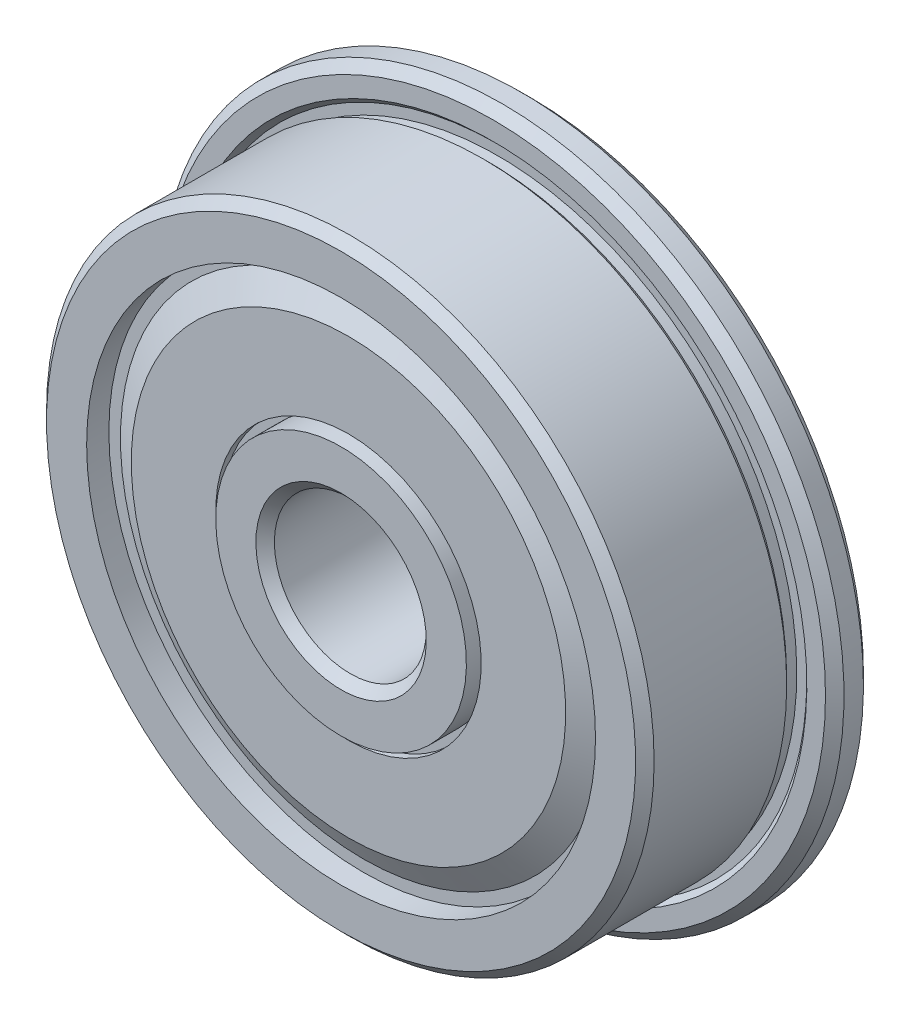
ISO-10303-21;
HEADER;
FILE_DESCRIPTION(('STEP AP214'),'2;1');
FILE_NAME('part.step','',(''),(''),'','','');
FILE_SCHEMA(('AUTOMOTIVE_DESIGN { 1 0 10303 214 1 1 1 1 }'));
ENDSEC;
DATA;
#1=APPLICATION_CONTEXT('core data for automotive mechanical design processes');
#2=APPLICATION_PROTOCOL_DEFINITION('international standard','automotive_design',2000,#1);
#3=PRODUCT_CONTEXT('',#1,'mechanical');
#4=PRODUCT('Part','Part','',(#3));
#5=PRODUCT_RELATED_PRODUCT_CATEGORY('part','',(#4));
#6=PRODUCT_DEFINITION_FORMATION('','',#4);
#7=PRODUCT_DEFINITION_CONTEXT('part definition',#1,'design');
#8=PRODUCT_DEFINITION('design','',#6,#7);
#9=PRODUCT_DEFINITION_SHAPE('','',#8);
#10=(LENGTH_UNIT() NAMED_UNIT(*) SI_UNIT(.MILLI.,.METRE.));
#11=(NAMED_UNIT(*) PLANE_ANGLE_UNIT() SI_UNIT($,.RADIAN.));
#12=(NAMED_UNIT(*) SI_UNIT($,.STERADIAN.) SOLID_ANGLE_UNIT());
#13=UNCERTAINTY_MEASURE_WITH_UNIT(LENGTH_MEASURE(1.E-05),#10,'distance_accuracy_value','');
#14=(GEOMETRIC_REPRESENTATION_CONTEXT(3) GLOBAL_UNCERTAINTY_ASSIGNED_CONTEXT((#13)) GLOBAL_UNIT_ASSIGNED_CONTEXT((#10,
#11,#12)) REPRESENTATION_CONTEXT('',''));
#15=CARTESIAN_POINT('',(0.,0.,0.));
#16=DIRECTION('',(0.,0.,1.));
#17=DIRECTION('',(1.,0.,0.));
#18=AXIS2_PLACEMENT_3D('',#15,#16,#17);
#19=CARTESIAN_POINT('',(0.,0.,0.));
#20=DIRECTION('',(0.,0.,1.));
#21=DIRECTION('',(0.,-1.,0.));
#22=AXIS2_PLACEMENT_3D('',#19,#20,#21);
#23=CYLINDRICAL_SURFACE('',#22,6.7);
#24=CARTESIAN_POINT('',(0.,0.,-1.72));
#25=DIRECTION('',(0.,0.,1.));
#26=DIRECTION('',(0.,-1.,0.));
#27=AXIS2_PLACEMENT_3D('',#24,#25,#26);
#28=CIRCLE('',#27,6.7);
#29=CARTESIAN_POINT('',(0.,-6.7,-1.72));
#30=VERTEX_POINT('',#29);
#31=EDGE_CURVE('E78',#30,#30,#28,.T.);
#32=ORIENTED_EDGE('',*,*,#31,.F.);
#33=EDGE_LOOP('',(#32));
#34=FACE_BOUND('',#33,.T.);
#35=CARTESIAN_POINT('',(0.,0.,-1.915));
#36=DIRECTION('',(0.,0.,1.));
#37=DIRECTION('',(0.,-1.,0.));
#38=AXIS2_PLACEMENT_3D('',#35,#36,#37);
#39=CIRCLE('',#38,6.7);
#40=CARTESIAN_POINT('',(0.,-6.7,-1.915));
#41=VERTEX_POINT('',#40);
#42=EDGE_CURVE('E12',#41,#41,#39,.T.);
#43=ORIENTED_EDGE('',*,*,#42,.T.);
#44=EDGE_LOOP('',(#43));
#45=FACE_BOUND('',#44,.T.);
#46=ADVANCED_FACE('F50',(#34,#45),#23,.T.);
#47=CARTESIAN_POINT('',(0.,6.7,-1.915));
#48=DIRECTION('',(0.,0.,1.));
#49=DIRECTION('',(0.,-1.,0.));
#50=AXIS2_PLACEMENT_3D('',#47,#48,#49);
#51=PLANE('',#50);
#52=ORIENTED_EDGE('',*,*,#42,.F.);
#53=EDGE_LOOP('',(#52));
#54=FACE_BOUND('',#53,.T.);
#55=CARTESIAN_POINT('',(0.,0.,-1.915));
#56=DIRECTION('',(0.,0.,1.));
#57=DIRECTION('',(0.,-1.,0.));
#58=AXIS2_PLACEMENT_3D('',#55,#56,#57);
#59=CIRCLE('',#58,6.39510723538121);
#60=CARTESIAN_POINT('',(0.,-6.39510723538121,-1.915));
#61=VERTEX_POINT('',#60);
#62=EDGE_CURVE('E56',#61,#61,#59,.T.);
#63=ORIENTED_EDGE('',*,*,#62,.T.);
#64=EDGE_LOOP('',(#63));
#65=FACE_BOUND('',#64,.T.);
#66=ADVANCED_FACE('F85',(#54,#65),#51,.F.);
#67=CARTESIAN_POINT('',(0.,0.,-2.305));
#68=DIRECTION('',(0.,0.,1.));
#69=DIRECTION('',(0.,-1.,0.));
#70=AXIS2_PLACEMENT_3D('',#67,#68,#69);
#71=CONICAL_SURFACE('',#70,5.71960742042935,1.0471975511966);
#72=ORIENTED_EDGE('',*,*,#62,.F.);
#73=EDGE_LOOP('',(#72));
#74=FACE_BOUND('',#73,.T.);
#75=CARTESIAN_POINT('',(0.,0.,-2.305));
#76=DIRECTION('',(0.,0.,1.));
#77=DIRECTION('',(0.,-1.,0.));
#78=AXIS2_PLACEMENT_3D('',#75,#76,#77);
#79=CIRCLE('',#78,5.71960742042935);
#80=CARTESIAN_POINT('',(0.,-5.71960742042935,-2.305));
#81=VERTEX_POINT('',#80);
#82=EDGE_CURVE('E60',#81,#81,#79,.T.);
#83=ORIENTED_EDGE('',*,*,#82,.T.);
#84=EDGE_LOOP('',(#83));
#85=FACE_BOUND('',#84,.T.);
#86=ADVANCED_FACE('F89',(#74,#85),#71,.T.);
#87=CARTESIAN_POINT('',(0.,5.71960742042935,-2.305));
#88=DIRECTION('',(0.,0.,1.));
#89=DIRECTION('',(0.,-1.,0.));
#90=AXIS2_PLACEMENT_3D('',#87,#88,#89);
#91=PLANE('',#90);
#92=ORIENTED_EDGE('',*,*,#82,.F.);
#93=EDGE_LOOP('',(#92));
#94=FACE_BOUND('',#93,.T.);
#95=CARTESIAN_POINT('',(0.,0.,-2.305));
#96=DIRECTION('',(0.,0.,1.));
#97=DIRECTION('',(0.,-1.,0.));
#98=AXIS2_PLACEMENT_3D('',#95,#96,#97);
#99=CIRCLE('',#98,3.495);
#100=CARTESIAN_POINT('',(0.,-3.495,-2.305));
#101=VERTEX_POINT('',#100);
#102=EDGE_CURVE('E64',#101,#101,#99,.T.);
#103=ORIENTED_EDGE('',*,*,#102,.T.);
#104=EDGE_LOOP('',(#103));
#105=FACE_BOUND('',#104,.T.);
#106=ADVANCED_FACE('F94',(#94,#105),#91,.F.);
#107=CARTESIAN_POINT('',(0.,0.,0.));
#108=DIRECTION('',(0.,0.,1.));
#109=DIRECTION('',(0.,-1.,0.));
#110=AXIS2_PLACEMENT_3D('',#107,#108,#109);
#111=CYLINDRICAL_SURFACE('',#110,3.495);
#112=ORIENTED_EDGE('',*,*,#102,.F.);
#113=EDGE_LOOP('',(#112));
#114=FACE_BOUND('',#113,.T.);
#115=CARTESIAN_POINT('',(0.,0.,-2.11));
#116=DIRECTION('',(0.,0.,1.));
#117=DIRECTION('',(0.,-1.,0.));
#118=AXIS2_PLACEMENT_3D('',#115,#116,#117);
#119=CIRCLE('',#118,3.495);
#120=CARTESIAN_POINT('',(0.,-3.495,-2.11));
#121=VERTEX_POINT('',#120);
#122=EDGE_CURVE('E69',#121,#121,#119,.T.);
#123=ORIENTED_EDGE('',*,*,#122,.T.);
#124=EDGE_LOOP('',(#123));
#125=FACE_BOUND('',#124,.T.);
#126=ADVANCED_FACE('F100',(#114,#125),#111,.F.);
#127=CARTESIAN_POINT('',(0.,5.66735732790528,-2.11));
#128=DIRECTION('',(0.,0.,-1.));
#129=DIRECTION('',(0.,1.,0.));
#130=AXIS2_PLACEMENT_3D('',#127,#128,#129);
#131=PLANE('',#130);
#132=ORIENTED_EDGE('',*,*,#122,.F.);
#133=EDGE_LOOP('',(#132));
#134=FACE_BOUND('',#133,.T.);
#135=CARTESIAN_POINT('',(0.,0.,-2.11));
#136=DIRECTION('',(0.,0.,1.));
#137=DIRECTION('',(0.,-1.,0.));
#138=AXIS2_PLACEMENT_3D('',#135,#136,#137);
#139=CIRCLE('',#138,5.66735732790528);
#140=CARTESIAN_POINT('',(0.,-5.66735732790528,-2.11));
#141=VERTEX_POINT('',#140);
#142=EDGE_CURVE('E72',#141,#141,#139,.T.);
#143=ORIENTED_EDGE('',*,*,#142,.T.);
#144=EDGE_LOOP('',(#143));
#145=FACE_BOUND('',#144,.T.);
#146=ADVANCED_FACE('F104',(#134,#145),#131,.F.);
#147=CARTESIAN_POINT('',(0.,0.,-1.72));
#148=DIRECTION('',(0.,0.,1.));
#149=DIRECTION('',(0.,-1.,0.));
#150=AXIS2_PLACEMENT_3D('',#147,#148,#149);
#151=CONICAL_SURFACE('',#150,6.34285714285714,1.0471975511966);
#152=ORIENTED_EDGE('',*,*,#142,.F.);
#153=EDGE_LOOP('',(#152));
#154=FACE_BOUND('',#153,.T.);
#155=CARTESIAN_POINT('',(0.,0.,-1.72));
#156=DIRECTION('',(0.,0.,1.));
#157=DIRECTION('',(0.,-1.,0.));
#158=AXIS2_PLACEMENT_3D('',#155,#156,#157);
#159=CIRCLE('',#158,6.34285714285714);
#160=CARTESIAN_POINT('',(0.,-6.34285714285714,-1.72));
#161=VERTEX_POINT('',#160);
#162=EDGE_CURVE('E75',#161,#161,#159,.T.);
#163=ORIENTED_EDGE('',*,*,#162,.T.);
#164=EDGE_LOOP('',(#163));
#165=FACE_BOUND('',#164,.T.);
#166=ADVANCED_FACE('F108',(#154,#165),#151,.F.);
#167=CARTESIAN_POINT('',(0.,6.7,-1.72));
#168=DIRECTION('',(0.,0.,-1.));
#169=DIRECTION('',(0.,1.,0.));
#170=AXIS2_PLACEMENT_3D('',#167,#168,#169);
#171=PLANE('',#170);
#172=ORIENTED_EDGE('',*,*,#162,.F.);
#173=EDGE_LOOP('',(#172));
#174=FACE_BOUND('',#173,.T.);
#175=ORIENTED_EDGE('',*,*,#31,.T.);
#176=EDGE_LOOP('',(#175));
#177=FACE_BOUND('',#176,.T.);
#178=ADVANCED_FACE('F82',(#174,#177),#171,.F.);
#179=CLOSED_SHELL('',(#46,#66,#86,#106,#126,#146,#166,#178));
#180=MANIFOLD_SOLID_BREP('B2',#179);
#181=CARTESIAN_POINT('',(0.,0.,0.));
#182=DIRECTION('',(0.,0.,1.));
#183=DIRECTION('',(0.,-1.,0.));
#184=AXIS2_PLACEMENT_3D('',#181,#182,#183);
#185=CYLINDRICAL_SURFACE('',#184,6.7);
#186=CARTESIAN_POINT('',(0.,0.,1.915));
#187=DIRECTION('',(0.,0.,1.));
#188=DIRECTION('',(0.,-1.,0.));
#189=AXIS2_PLACEMENT_3D('',#186,#187,#188);
#190=CIRCLE('',#189,6.7);
#191=CARTESIAN_POINT('',(0.,-6.7,1.915));
#192=VERTEX_POINT('',#191);
#193=EDGE_CURVE('E49',#192,#192,#190,.T.);
#194=ORIENTED_EDGE('',*,*,#193,.F.);
#195=EDGE_LOOP('',(#194));
#196=FACE_BOUND('',#195,.T.);
#197=CARTESIAN_POINT('',(0.,0.,1.72));
#198=DIRECTION('',(0.,0.,1.));
#199=DIRECTION('',(0.,-1.,0.));
#200=AXIS2_PLACEMENT_3D('',#197,#198,#199);
#201=CIRCLE('',#200,6.7);
#202=CARTESIAN_POINT('',(0.,-6.7,1.72));
#203=VERTEX_POINT('',#202);
#204=EDGE_CURVE('E206',#203,#203,#201,.T.);
#205=ORIENTED_EDGE('',*,*,#204,.T.);
#206=EDGE_LOOP('',(#205));
#207=FACE_BOUND('',#206,.T.);
#208=ADVANCED_FACE('F178',(#196,#207),#185,.T.);
#209=CARTESIAN_POINT('',(0.,6.7,1.915));
#210=DIRECTION('',(0.,0.,-1.));
#211=DIRECTION('',(0.,1.,0.));
#212=AXIS2_PLACEMENT_3D('',#209,#210,#211);
#213=PLANE('',#212);
#214=CARTESIAN_POINT('',(0.,0.,1.915));
#215=DIRECTION('',(0.,0.,1.));
#216=DIRECTION('',(0.,-1.,0.));
#217=AXIS2_PLACEMENT_3D('',#214,#215,#216);
#218=CIRCLE('',#217,6.39510723538121);
#219=CARTESIAN_POINT('',(0.,-6.39510723538121,1.915));
#220=VERTEX_POINT('',#219);
#221=EDGE_CURVE('E184',#220,#220,#218,.T.);
#222=ORIENTED_EDGE('',*,*,#221,.F.);
#223=EDGE_LOOP('',(#222));
#224=FACE_BOUND('',#223,.T.);
#225=ORIENTED_EDGE('',*,*,#193,.T.);
#226=EDGE_LOOP('',(#225));
#227=FACE_BOUND('',#226,.T.);
#228=ADVANCED_FACE('F243',(#224,#227),#213,.F.);
#229=CARTESIAN_POINT('',(0.,0.,1.915));
#230=DIRECTION('',(0.,0.,-1.));
#231=DIRECTION('',(0.,1.,0.));
#232=AXIS2_PLACEMENT_3D('',#229,#230,#231);
#233=CONICAL_SURFACE('',#232,6.39510723538121,1.0471975511966);
#234=CARTESIAN_POINT('',(0.,0.,2.305));
#235=DIRECTION('',(0.,0.,1.));
#236=DIRECTION('',(0.,-1.,0.));
#237=AXIS2_PLACEMENT_3D('',#234,#235,#236);
#238=CIRCLE('',#237,5.71960742042935);
#239=CARTESIAN_POINT('',(0.,-5.71960742042935,2.305));
#240=VERTEX_POINT('',#239);
#241=EDGE_CURVE('E188',#240,#240,#238,.T.);
#242=ORIENTED_EDGE('',*,*,#241,.F.);
#243=EDGE_LOOP('',(#242));
#244=FACE_BOUND('',#243,.T.);
#245=ORIENTED_EDGE('',*,*,#221,.T.);
#246=EDGE_LOOP('',(#245));
#247=FACE_BOUND('',#246,.T.);
#248=ADVANCED_FACE('F238',(#244,#247),#233,.T.);
#249=CARTESIAN_POINT('',(0.,5.71960742042935,2.305));
#250=DIRECTION('',(0.,0.,-1.));
#251=DIRECTION('',(0.,1.,0.));
#252=AXIS2_PLACEMENT_3D('',#249,#250,#251);
#253=PLANE('',#252);
#254=CARTESIAN_POINT('',(0.,0.,2.305));
#255=DIRECTION('',(0.,0.,1.));
#256=DIRECTION('',(0.,-1.,0.));
#257=AXIS2_PLACEMENT_3D('',#254,#255,#256);
#258=CIRCLE('',#257,3.495);
#259=CARTESIAN_POINT('',(0.,-3.495,2.305));
#260=VERTEX_POINT('',#259);
#261=EDGE_CURVE('E192',#260,#260,#258,.T.);
#262=ORIENTED_EDGE('',*,*,#261,.F.);
#263=EDGE_LOOP('',(#262));
#264=FACE_BOUND('',#263,.T.);
#265=ORIENTED_EDGE('',*,*,#241,.T.);
#266=EDGE_LOOP('',(#265));
#267=FACE_BOUND('',#266,.T.);
#268=ADVANCED_FACE('F232',(#264,#267),#253,.F.);
#269=CARTESIAN_POINT('',(0.,0.,0.));
#270=DIRECTION('',(0.,0.,1.));
#271=DIRECTION('',(0.,-1.,0.));
#272=AXIS2_PLACEMENT_3D('',#269,#270,#271);
#273=CYLINDRICAL_SURFACE('',#272,3.495);
#274=CARTESIAN_POINT('',(0.,0.,2.11));
#275=DIRECTION('',(0.,0.,1.));
#276=DIRECTION('',(0.,-1.,0.));
#277=AXIS2_PLACEMENT_3D('',#274,#275,#276);
#278=CIRCLE('',#277,3.495);
#279=CARTESIAN_POINT('',(0.,-3.495,2.11));
#280=VERTEX_POINT('',#279);
#281=EDGE_CURVE('E197',#280,#280,#278,.T.);
#282=ORIENTED_EDGE('',*,*,#281,.F.);
#283=EDGE_LOOP('',(#282));
#284=FACE_BOUND('',#283,.T.);
#285=ORIENTED_EDGE('',*,*,#261,.T.);
#286=EDGE_LOOP('',(#285));
#287=FACE_BOUND('',#286,.T.);
#288=ADVANCED_FACE('F226',(#284,#287),#273,.F.);
#289=CARTESIAN_POINT('',(0.,5.66735732790528,2.11));
#290=DIRECTION('',(0.,0.,1.));
#291=DIRECTION('',(0.,-1.,0.));
#292=AXIS2_PLACEMENT_3D('',#289,#290,#291);
#293=PLANE('',#292);
#294=CARTESIAN_POINT('',(0.,0.,2.11));
#295=DIRECTION('',(0.,0.,1.));
#296=DIRECTION('',(0.,-1.,0.));
#297=AXIS2_PLACEMENT_3D('',#294,#295,#296);
#298=CIRCLE('',#297,5.66735732790528);
#299=CARTESIAN_POINT('',(0.,-5.66735732790528,2.11));
#300=VERTEX_POINT('',#299);
#301=EDGE_CURVE('E200',#300,#300,#298,.T.);
#302=ORIENTED_EDGE('',*,*,#301,.F.);
#303=EDGE_LOOP('',(#302));
#304=FACE_BOUND('',#303,.T.);
#305=ORIENTED_EDGE('',*,*,#281,.T.);
#306=EDGE_LOOP('',(#305));
#307=FACE_BOUND('',#306,.T.);
#308=ADVANCED_FACE('F220',(#304,#307),#293,.F.);
#309=CARTESIAN_POINT('',(0.,0.,2.11));
#310=DIRECTION('',(0.,0.,-1.));
#311=DIRECTION('',(0.,1.,0.));
#312=AXIS2_PLACEMENT_3D('',#309,#310,#311);
#313=CONICAL_SURFACE('',#312,5.66735732790528,1.0471975511966);
#314=CARTESIAN_POINT('',(0.,0.,1.72));
#315=DIRECTION('',(0.,0.,1.));
#316=DIRECTION('',(0.,-1.,0.));
#317=AXIS2_PLACEMENT_3D('',#314,#315,#316);
#318=CIRCLE('',#317,6.34285714285714);
#319=CARTESIAN_POINT('',(0.,-6.34285714285714,1.72));
#320=VERTEX_POINT('',#319);
#321=EDGE_CURVE('E203',#320,#320,#318,.T.);
#322=ORIENTED_EDGE('',*,*,#321,.F.);
#323=EDGE_LOOP('',(#322));
#324=FACE_BOUND('',#323,.T.);
#325=ORIENTED_EDGE('',*,*,#301,.T.);
#326=EDGE_LOOP('',(#325));
#327=FACE_BOUND('',#326,.T.);
#328=ADVANCED_FACE('F214',(#324,#327),#313,.F.);
#329=CARTESIAN_POINT('',(0.,6.7,1.72));
#330=DIRECTION('',(0.,0.,1.));
#331=DIRECTION('',(0.,-1.,0.));
#332=AXIS2_PLACEMENT_3D('',#329,#330,#331);
#333=PLANE('',#332);
#334=ORIENTED_EDGE('',*,*,#204,.F.);
#335=EDGE_LOOP('',(#334));
#336=FACE_BOUND('',#335,.T.);
#337=ORIENTED_EDGE('',*,*,#321,.T.);
#338=EDGE_LOOP('',(#337));
#339=FACE_BOUND('',#338,.T.);
#340=ADVANCED_FACE('F211',(#336,#339),#333,.F.);
#341=CLOSED_SHELL('',(#208,#228,#248,#268,#288,#308,#328,#340));
#342=MANIFOLD_SOLID_BREP('B7',#341);
#343=CARTESIAN_POINT('',(-3.21393804843265,3.83022221559493,0.));
#344=DIRECTION('',(-0.64278760968653,0.766044443118986,0.));
#345=DIRECTION('',(0.766044443118986,0.64278760968653,0.));
#346=AXIS2_PLACEMENT_3D('',#343,#344,#345);
#347=SPHERICAL_SURFACE('',#346,1.1905);
#348=CARTESIAN_POINT('',(-3.97917669776446,4.74219812512808,0.));
#349=VERTEX_POINT('',#348);
#350=VERTEX_LOOP('',#349);
#351=FACE_BOUND('',#350,.T.);
#352=ADVANCED_FACE('F306',(#351),#347,.T.);
#353=CLOSED_SHELL('',(#352));
#354=MANIFOLD_SOLID_BREP('B44',#353);
#355=CARTESIAN_POINT('',(-4.92403876506103,0.868240888334702,0.));
#356=DIRECTION('',(-0.984807753012206,0.17364817766694,0.));
#357=DIRECTION('',(0.17364817766694,0.984807753012206,0.));
#358=AXIS2_PLACEMENT_3D('',#355,#356,#357);
#359=SPHERICAL_SURFACE('',#358,1.1905);
#360=CARTESIAN_POINT('',(-6.09645239502206,1.07496904384719,0.));
#361=VERTEX_POINT('',#360);
#362=VERTEX_LOOP('',#361);
#363=FACE_BOUND('',#362,.T.);
#364=ADVANCED_FACE('F325',(#363),#359,.T.);
#365=CLOSED_SHELL('',(#364));
#366=MANIFOLD_SOLID_BREP('B174',#365);
#367=CARTESIAN_POINT('',(-4.33012701892222,-2.49999999999996,0.));
#368=DIRECTION('',(-0.866025403784443,-0.499999999999992,0.));
#369=DIRECTION('',(-0.499999999999992,0.866025403784443,0.));
#370=AXIS2_PLACEMENT_3D('',#367,#368,#369);
#371=SPHERICAL_SURFACE('',#370,1.1905);
#372=CARTESIAN_POINT('',(-5.3611302621276,-3.09524999999995,0.));
#373=VERTEX_POINT('',#372);
#374=VERTEX_LOOP('',#373);
#375=FACE_BOUND('',#374,.T.);
#376=ADVANCED_FACE('F344',(#375),#371,.T.);
#377=CLOSED_SHELL('',(#376));
#378=MANIFOLD_SOLID_BREP('B302',#377);
#379=CARTESIAN_POINT('',(-1.71010071662838,-4.69846310392953,0.));
#380=DIRECTION('',(-0.342020143325676,-0.939692620785906,0.));
#381=DIRECTION('',(-0.939692620785906,0.342020143325676,0.));
#382=AXIS2_PLACEMENT_3D('',#379,#380,#381);
#383=SPHERICAL_SURFACE('',#382,1.1905);
#384=CARTESIAN_POINT('',(-2.1172756972576,-5.81716716897515,0.));
#385=VERTEX_POINT('',#384);
#386=VERTEX_LOOP('',#385);
#387=FACE_BOUND('',#386,.T.);
#388=ADVANCED_FACE('F363',(#387),#383,.T.);
#389=CLOSED_SHELL('',(#388));
#390=MANIFOLD_SOLID_BREP('B321',#389);
#391=CARTESIAN_POINT('',(1.71010071662832,-4.69846310392955,0.));
#392=DIRECTION('',(0.342020143325663,-0.939692620785911,0.));
#393=DIRECTION('',(-0.939692620785911,-0.342020143325663,0.));
#394=AXIS2_PLACEMENT_3D('',#391,#392,#393);
#395=SPHERICAL_SURFACE('',#394,1.1905);
#396=CARTESIAN_POINT('',(2.11727569725752,-5.81716716897518,0.));
#397=VERTEX_POINT('',#396);
#398=VERTEX_LOOP('',#397);
#399=FACE_BOUND('',#398,.T.);
#400=ADVANCED_FACE('F382',(#399),#395,.T.);
#401=CLOSED_SHELL('',(#400));
#402=MANIFOLD_SOLID_BREP('B340',#401);
#403=CARTESIAN_POINT('',(4.33012701892218,-2.50000000000002,0.));
#404=DIRECTION('',(0.866025403784437,-0.500000000000004,0.));
#405=DIRECTION('',(-0.500000000000004,-0.866025403784437,0.));
#406=AXIS2_PLACEMENT_3D('',#403,#404,#405);
#407=SPHERICAL_SURFACE('',#406,1.1905);
#408=CARTESIAN_POINT('',(5.36113026212755,-3.09525000000002,0.));
#409=VERTEX_POINT('',#408);
#410=VERTEX_LOOP('',#409);
#411=FACE_BOUND('',#410,.T.);
#412=ADVANCED_FACE('F401',(#411),#407,.T.);
#413=CLOSED_SHELL('',(#412));
#414=MANIFOLD_SOLID_BREP('B359',#413);
#415=CARTESIAN_POINT('',(4.92403876506104,0.868240888334637,0.));
#416=DIRECTION('',(0.984807753012209,0.173648177666928,0.));
#417=DIRECTION('',(0.173648177666928,-0.984807753012209,0.));
#418=AXIS2_PLACEMENT_3D('',#415,#416,#417);
#419=SPHERICAL_SURFACE('',#418,1.1905);
#420=CARTESIAN_POINT('',(6.09645239502208,1.07496904384711,0.));
#421=VERTEX_POINT('',#420);
#422=VERTEX_LOOP('',#421);
#423=FACE_BOUND('',#422,.T.);
#424=ADVANCED_FACE('F420',(#423),#419,.T.);
#425=CLOSED_SHELL('',(#424));
#426=MANIFOLD_SOLID_BREP('B378',#425);
#427=CARTESIAN_POINT('',(3.2139380484327,3.83022221559489,0.));
#428=DIRECTION('',(0.64278760968654,0.766044443118977,0.));
#429=DIRECTION('',(0.766044443118977,-0.64278760968654,0.));
#430=AXIS2_PLACEMENT_3D('',#427,#428,#429);
#431=SPHERICAL_SURFACE('',#430,1.1905);
#432=CARTESIAN_POINT('',(3.97917669776453,4.74219812512803,0.));
#433=VERTEX_POINT('',#432);
#434=VERTEX_LOOP('',#433);
#435=FACE_BOUND('',#434,.T.);
#436=ADVANCED_FACE('F439',(#435),#431,.T.);
#437=CLOSED_SHELL('',(#436));
#438=MANIFOLD_SOLID_BREP('B397',#437);
#439=CARTESIAN_POINT('',(0.,5.,0.));
#440=DIRECTION('',(0.,1.,0.));
#441=DIRECTION('',(1.,0.,0.));
#442=AXIS2_PLACEMENT_3D('',#439,#440,#441);
#443=SPHERICAL_SURFACE('',#442,1.1905);
#444=CARTESIAN_POINT('',(0.,6.1905,0.));
#445=VERTEX_POINT('',#444);
#446=VERTEX_LOOP('',#445);
#447=FACE_BOUND('',#446,.T.);
#448=ADVANCED_FACE('F461',(#447),#443,.T.);
#449=CLOSED_SHELL('',(#448));
#450=MANIFOLD_SOLID_BREP('B416',#449);
#451=CARTESIAN_POINT('',(0.,0.,0.));
#452=DIRECTION('',(0.,0.,1.));
#453=DIRECTION('',(0.,-1.,0.));
#454=AXIS2_PLACEMENT_3D('',#451,#452,#453);
#455=CYLINDRICAL_SURFACE('',#454,3.95);
#456=CARTESIAN_POINT('',(0.,0.,0.561061716747812));
#457=DIRECTION('',(0.,0.,1.));
#458=DIRECTION('',(0.,-1.,0.));
#459=AXIS2_PLACEMENT_3D('',#456,#457,#458);
#460=CIRCLE('',#459,3.95);
#461=CARTESIAN_POINT('',(0.,-3.95,0.561061716747812));
#462=VERTEX_POINT('',#461);
#463=EDGE_CURVE('E506',#462,#462,#460,.T.);
#464=ORIENTED_EDGE('',*,*,#463,.T.);
#465=EDGE_LOOP('',(#464));
#466=FACE_BOUND('',#465,.T.);
#467=CARTESIAN_POINT('',(0.,0.,1.72));
#468=DIRECTION('',(0.,0.,1.));
#469=DIRECTION('',(0.,-1.,0.));
#470=AXIS2_PLACEMENT_3D('',#467,#468,#469);
#471=CIRCLE('',#470,3.95);
#472=CARTESIAN_POINT('',(0.,-3.95,1.72));
#473=VERTEX_POINT('',#472);
#474=EDGE_CURVE('E524',#473,#473,#471,.T.);
#475=ORIENTED_EDGE('',*,*,#474,.F.);
#476=EDGE_LOOP('',(#475));
#477=FACE_BOUND('',#476,.T.);
#478=ADVANCED_FACE('F483',(#466,#477),#455,.T.);
#479=CARTESIAN_POINT('',(0.,2.,2.5));
#480=DIRECTION('',(0.,0.,-1.));
#481=DIRECTION('',(0.,1.,0.));
#482=AXIS2_PLACEMENT_3D('',#479,#480,#481);
#483=PLANE('',#482);
#484=CARTESIAN_POINT('',(0.,0.,2.5));
#485=DIRECTION('',(0.,0.,-1.));
#486=DIRECTION('',(0.,1.,0.));
#487=AXIS2_PLACEMENT_3D('',#484,#485,#486);
#488=CIRCLE('',#487,2.24375);
#489=CARTESIAN_POINT('',(0.,2.24375,2.5));
#490=VERTEX_POINT('',#489);
#491=EDGE_CURVE('E460',#490,#490,#488,.T.);
#492=ORIENTED_EDGE('',*,*,#491,.T.);
#493=EDGE_LOOP('',(#492));
#494=FACE_BOUND('',#493,.T.);
#495=CARTESIAN_POINT('',(0.,0.,2.5));
#496=DIRECTION('',(0.,0.,1.));
#497=DIRECTION('',(0.,-1.,0.));
#498=AXIS2_PLACEMENT_3D('',#495,#496,#497);
#499=CIRCLE('',#498,3.3);
#500=CARTESIAN_POINT('',(0.,-3.3,2.5));
#501=VERTEX_POINT('',#500);
#502=EDGE_CURVE('E518',#501,#501,#499,.T.);
#503=ORIENTED_EDGE('',*,*,#502,.T.);
#504=EDGE_LOOP('',(#503));
#505=FACE_BOUND('',#504,.T.);
#506=ADVANCED_FACE('F532',(#494,#505),#483,.F.);
#507=CARTESIAN_POINT('',(0.,0.,0.));
#508=DIRECTION('',(0.,0.,1.));
#509=DIRECTION('',(0.,-1.,0.));
#510=AXIS2_PLACEMENT_3D('',#507,#508,#509);
#511=CYLINDRICAL_SURFACE('',#510,3.95);
#512=CARTESIAN_POINT('',(0.,0.,-0.561061716747813));
#513=DIRECTION('',(0.,0.,1.));
#514=DIRECTION('',(0.,-1.,0.));
#515=AXIS2_PLACEMENT_3D('',#512,#513,#514);
#516=CIRCLE('',#515,3.95);
#517=CARTESIAN_POINT('',(0.,-3.95,-0.561061716747813));
#518=VERTEX_POINT('',#517);
#519=EDGE_CURVE('E503',#518,#518,#516,.T.);
#520=ORIENTED_EDGE('',*,*,#519,.F.);
#521=EDGE_LOOP('',(#520));
#522=FACE_BOUND('',#521,.T.);
#523=CARTESIAN_POINT('',(0.,0.,-1.72));
#524=DIRECTION('',(0.,0.,1.));
#525=DIRECTION('',(0.,-1.,0.));
#526=AXIS2_PLACEMENT_3D('',#523,#524,#525);
#527=CIRCLE('',#526,3.95);
#528=CARTESIAN_POINT('',(0.,-3.95,-1.72));
#529=VERTEX_POINT('',#528);
#530=EDGE_CURVE('E515',#529,#529,#527,.T.);
#531=ORIENTED_EDGE('',*,*,#530,.T.);
#532=EDGE_LOOP('',(#531));
#533=FACE_BOUND('',#532,.T.);
#534=ADVANCED_FACE('F538',(#522,#533),#511,.T.);
#535=CARTESIAN_POINT('',(0.,3.95,-2.5));
#536=DIRECTION('',(0.,0.,1.));
#537=DIRECTION('',(0.,-1.,0.));
#538=AXIS2_PLACEMENT_3D('',#535,#536,#537);
#539=PLANE('',#538);
#540=CARTESIAN_POINT('',(0.,0.,-2.5));
#541=DIRECTION('',(0.,0.,1.));
#542=DIRECTION('',(0.,-1.,0.));
#543=AXIS2_PLACEMENT_3D('',#540,#541,#542);
#544=CIRCLE('',#543,2.24375);
#545=CARTESIAN_POINT('',(0.,-2.24375,-2.5));
#546=VERTEX_POINT('',#545);
#547=EDGE_CURVE('E498',#546,#546,#544,.T.);
#548=ORIENTED_EDGE('',*,*,#547,.T.);
#549=EDGE_LOOP('',(#548));
#550=FACE_BOUND('',#549,.T.);
#551=CARTESIAN_POINT('',(0.,0.,-2.5));
#552=DIRECTION('',(0.,0.,1.));
#553=DIRECTION('',(0.,-1.,0.));
#554=AXIS2_PLACEMENT_3D('',#551,#552,#553);
#555=CIRCLE('',#554,3.3);
#556=CARTESIAN_POINT('',(0.,-3.3,-2.5));
#557=VERTEX_POINT('',#556);
#558=EDGE_CURVE('E509',#557,#557,#555,.T.);
#559=ORIENTED_EDGE('',*,*,#558,.F.);
#560=EDGE_LOOP('',(#559));
#561=FACE_BOUND('',#560,.T.);
#562=ADVANCED_FACE('F546',(#550,#561),#539,.F.);
#563=CARTESIAN_POINT('',(0.,0.,0.));
#564=DIRECTION('',(0.,0.,1.));
#565=DIRECTION('',(0.,-1.,0.));
#566=AXIS2_PLACEMENT_3D('',#563,#564,#565);
#567=TOROIDAL_SURFACE('',#566,5.,1.1905);
#568=ORIENTED_EDGE('',*,*,#463,.F.);
#569=EDGE_LOOP('',(#568));
#570=FACE_BOUND('',#569,.T.);
#571=ORIENTED_EDGE('',*,*,#519,.T.);
#572=EDGE_LOOP('',(#571));
#573=FACE_BOUND('',#572,.T.);
#574=ADVANCED_FACE('F542',(#570,#573),#567,.F.);
#575=CARTESIAN_POINT('',(0.,0.,0.));
#576=DIRECTION('',(0.,0.,1.));
#577=DIRECTION('',(0.,-1.,0.));
#578=AXIS2_PLACEMENT_3D('',#575,#576,#577);
#579=CYLINDRICAL_SURFACE('',#578,2.);
#580=CARTESIAN_POINT('',(0.,0.,-2.25625));
#581=DIRECTION('',(0.,0.,1.));
#582=DIRECTION('',(0.,-1.,0.));
#583=AXIS2_PLACEMENT_3D('',#580,#581,#582);
#584=CIRCLE('',#583,2.);
#585=CARTESIAN_POINT('',(0.,-2.,-2.25625));
#586=VERTEX_POINT('',#585);
#587=EDGE_CURVE('E490',#586,#586,#584,.F.);
#588=ORIENTED_EDGE('',*,*,#587,.T.);
#589=EDGE_LOOP('',(#588));
#590=FACE_BOUND('',#589,.T.);
#591=CARTESIAN_POINT('',(0.,0.,2.25625));
#592=DIRECTION('',(0.,0.,-1.));
#593=DIRECTION('',(0.,1.,0.));
#594=AXIS2_PLACEMENT_3D('',#591,#592,#593);
#595=CIRCLE('',#594,2.);
#596=CARTESIAN_POINT('',(0.,2.,2.25625));
#597=VERTEX_POINT('',#596);
#598=EDGE_CURVE('E494',#597,#597,#595,.F.);
#599=ORIENTED_EDGE('',*,*,#598,.T.);
#600=EDGE_LOOP('',(#599));
#601=FACE_BOUND('',#600,.T.);
#602=ADVANCED_FACE('F545',(#590,#601),#579,.F.);
#603=CARTESIAN_POINT('',(0.,0.,-2.5));
#604=DIRECTION('',(0.,0.,-1.));
#605=DIRECTION('',(0.,1.,0.));
#606=AXIS2_PLACEMENT_3D('',#603,#604,#605);
#607=CONICAL_SURFACE('',#606,2.24375,0.785398163397448);
#608=ORIENTED_EDGE('',*,*,#587,.F.);
#609=EDGE_LOOP('',(#608));
#610=FACE_BOUND('',#609,.T.);
#611=ORIENTED_EDGE('',*,*,#547,.F.);
#612=EDGE_LOOP('',(#611));
#613=FACE_BOUND('',#612,.T.);
#614=ADVANCED_FACE('F550',(#610,#613),#607,.F.);
#615=CARTESIAN_POINT('',(0.,0.,2.25625));
#616=DIRECTION('',(0.,0.,1.));
#617=DIRECTION('',(0.,-1.,0.));
#618=AXIS2_PLACEMENT_3D('',#615,#616,#617);
#619=CONICAL_SURFACE('',#618,2.,0.785398163397448);
#620=ORIENTED_EDGE('',*,*,#491,.F.);
#621=EDGE_LOOP('',(#620));
#622=FACE_BOUND('',#621,.T.);
#623=ORIENTED_EDGE('',*,*,#598,.F.);
#624=EDGE_LOOP('',(#623));
#625=FACE_BOUND('',#624,.T.);
#626=ADVANCED_FACE('F485',(#622,#625),#619,.F.);
#627=CARTESIAN_POINT('',(0.,0.,0.));
#628=DIRECTION('',(0.,0.,1.));
#629=DIRECTION('',(0.,-1.,0.));
#630=AXIS2_PLACEMENT_3D('',#627,#628,#629);
#631=CYLINDRICAL_SURFACE('',#630,3.3);
#632=ORIENTED_EDGE('',*,*,#558,.T.);
#633=EDGE_LOOP('',(#632));
#634=FACE_BOUND('',#633,.T.);
#635=CARTESIAN_POINT('',(0.,0.,-1.72));
#636=DIRECTION('',(0.,0.,1.));
#637=DIRECTION('',(0.,-1.,0.));
#638=AXIS2_PLACEMENT_3D('',#635,#636,#637);
#639=CIRCLE('',#638,3.3);
#640=CARTESIAN_POINT('',(0.,-3.3,-1.72));
#641=VERTEX_POINT('',#640);
#642=EDGE_CURVE('E512',#641,#641,#639,.T.);
#643=ORIENTED_EDGE('',*,*,#642,.F.);
#644=EDGE_LOOP('',(#643));
#645=FACE_BOUND('',#644,.T.);
#646=ADVANCED_FACE('F557',(#634,#645),#631,.T.);
#647=CARTESIAN_POINT('',(0.,3.95,-1.72));
#648=DIRECTION('',(0.,0.,-1.));
#649=DIRECTION('',(0.,1.,0.));
#650=AXIS2_PLACEMENT_3D('',#647,#648,#649);
#651=PLANE('',#650);
#652=ORIENTED_EDGE('',*,*,#642,.T.);
#653=EDGE_LOOP('',(#652));
#654=FACE_BOUND('',#653,.T.);
#655=ORIENTED_EDGE('',*,*,#530,.F.);
#656=EDGE_LOOP('',(#655));
#657=FACE_BOUND('',#656,.T.);
#658=ADVANCED_FACE('F569',(#654,#657),#651,.T.);
#659=CARTESIAN_POINT('',(0.,0.,0.));
#660=DIRECTION('',(0.,0.,1.));
#661=DIRECTION('',(0.,-1.,0.));
#662=AXIS2_PLACEMENT_3D('',#659,#660,#661);
#663=CYLINDRICAL_SURFACE('',#662,3.3);
#664=CARTESIAN_POINT('',(0.,0.,1.72));
#665=DIRECTION('',(0.,0.,1.));
#666=DIRECTION('',(0.,-1.,0.));
#667=AXIS2_PLACEMENT_3D('',#664,#665,#666);
#668=CIRCLE('',#667,3.3);
#669=CARTESIAN_POINT('',(0.,-3.3,1.72));
#670=VERTEX_POINT('',#669);
#671=EDGE_CURVE('E521',#670,#670,#668,.T.);
#672=ORIENTED_EDGE('',*,*,#671,.T.);
#673=EDGE_LOOP('',(#672));
#674=FACE_BOUND('',#673,.T.);
#675=ORIENTED_EDGE('',*,*,#502,.F.);
#676=EDGE_LOOP('',(#675));
#677=FACE_BOUND('',#676,.T.);
#678=ADVANCED_FACE('F575',(#674,#677),#663,.T.);
#679=CARTESIAN_POINT('',(0.,3.95,1.72));
#680=DIRECTION('',(0.,0.,1.));
#681=DIRECTION('',(0.,-1.,0.));
#682=AXIS2_PLACEMENT_3D('',#679,#680,#681);
#683=PLANE('',#682);
#684=ORIENTED_EDGE('',*,*,#474,.T.);
#685=EDGE_LOOP('',(#684));
#686=FACE_BOUND('',#685,.T.);
#687=ORIENTED_EDGE('',*,*,#671,.F.);
#688=EDGE_LOOP('',(#687));
#689=FACE_BOUND('',#688,.T.);
#690=ADVANCED_FACE('F528',(#686,#689),#683,.T.);
#691=CLOSED_SHELL('',(#478,#506,#534,#562,#574,#602,#614,#626,#646,#658,#678,#690));
#692=MANIFOLD_SOLID_BREP('B435',#691);
#693=CARTESIAN_POINT('',(0.,6.05,-2.5));
#694=DIRECTION('',(0.,0.,1.));
#695=DIRECTION('',(0.,-1.,0.));
#696=AXIS2_PLACEMENT_3D('',#693,#694,#695);
#697=PLANE('',#696);
#698=CARTESIAN_POINT('',(0.,0.,-2.5));
#699=DIRECTION('',(0.,0.,1.));
#700=DIRECTION('',(0.,-1.,0.));
#701=AXIS2_PLACEMENT_3D('',#698,#699,#700);
#702=CIRCLE('',#701,8.75625);
#703=CARTESIAN_POINT('',(0.,-8.75625,-2.5));
#704=VERTEX_POINT('',#703);
#705=EDGE_CURVE('E681',#704,#704,#702,.F.);
#706=ORIENTED_EDGE('',*,*,#705,.T.);
#707=EDGE_LOOP('',(#706));
#708=FACE_BOUND('',#707,.T.);
#709=CARTESIAN_POINT('',(0.,0.,-2.5));
#710=DIRECTION('',(0.,0.,1.));
#711=DIRECTION('',(0.,-1.,0.));
#712=AXIS2_PLACEMENT_3D('',#709,#710,#711);
#713=CIRCLE('',#712,6.7);
#714=CARTESIAN_POINT('',(0.,-6.7,-2.5));
#715=VERTEX_POINT('',#714);
#716=EDGE_CURVE('E722',#715,#715,#713,.T.);
#717=ORIENTED_EDGE('',*,*,#716,.T.);
#718=EDGE_LOOP('',(#717));
#719=FACE_BOUND('',#718,.T.);
#720=ADVANCED_FACE('F666',(#708,#719),#697,.F.);
#721=CARTESIAN_POINT('',(0.,0.,0.));
#722=DIRECTION('',(0.,0.,1.));
#723=DIRECTION('',(0.,-1.,0.));
#724=AXIS2_PLACEMENT_3D('',#721,#722,#723);
#725=CYLINDRICAL_SURFACE('',#724,6.05);
#726=CARTESIAN_POINT('',(0.,0.,-0.561061716747813));
#727=DIRECTION('',(0.,0.,1.));
#728=DIRECTION('',(0.,-1.,0.));
#729=AXIS2_PLACEMENT_3D('',#726,#727,#728);
#730=CIRCLE('',#729,6.05);
#731=CARTESIAN_POINT('',(0.,-6.05,-0.561061716747814));
#732=VERTEX_POINT('',#731);
#733=EDGE_CURVE('E692',#732,#732,#730,.T.);
#734=ORIENTED_EDGE('',*,*,#733,.T.);
#735=EDGE_LOOP('',(#734));
#736=FACE_BOUND('',#735,.T.);
#737=CARTESIAN_POINT('',(0.,0.,-1.72));
#738=DIRECTION('',(0.,0.,1.));
#739=DIRECTION('',(0.,-1.,0.));
#740=AXIS2_PLACEMENT_3D('',#737,#738,#739);
#741=CIRCLE('',#740,6.05);
#742=CARTESIAN_POINT('',(0.,-6.05,-1.72));
#743=VERTEX_POINT('',#742);
#744=EDGE_CURVE('E728',#743,#743,#741,.T.);
#745=ORIENTED_EDGE('',*,*,#744,.F.);
#746=EDGE_LOOP('',(#745));
#747=FACE_BOUND('',#746,.T.);
#748=ADVANCED_FACE('F735',(#736,#747),#725,.F.);
#749=CARTESIAN_POINT('',(0.,0.,0.));
#750=DIRECTION('',(0.,0.,1.));
#751=DIRECTION('',(0.,-1.,0.));
#752=AXIS2_PLACEMENT_3D('',#749,#750,#751);
#753=CYLINDRICAL_SURFACE('',#752,6.05);
#754=CARTESIAN_POINT('',(0.,0.,0.561061716747812));
#755=DIRECTION('',(0.,0.,1.));
#756=DIRECTION('',(0.,-1.,0.));
#757=AXIS2_PLACEMENT_3D('',#754,#755,#756);
#758=CIRCLE('',#757,6.05);
#759=CARTESIAN_POINT('',(0.,-6.05,0.561061716747812));
#760=VERTEX_POINT('',#759);
#761=EDGE_CURVE('E695',#760,#760,#758,.T.);
#762=ORIENTED_EDGE('',*,*,#761,.F.);
#763=EDGE_LOOP('',(#762));
#764=FACE_BOUND('',#763,.T.);
#765=CARTESIAN_POINT('',(0.,0.,1.72));
#766=DIRECTION('',(0.,0.,1.));
#767=DIRECTION('',(0.,-1.,0.));
#768=AXIS2_PLACEMENT_3D('',#765,#766,#767);
#769=CIRCLE('',#768,6.05);
#770=CARTESIAN_POINT('',(0.,-6.05,1.72));
#771=VERTEX_POINT('',#770);
#772=EDGE_CURVE('E719',#771,#771,#769,.T.);
#773=ORIENTED_EDGE('',*,*,#772,.T.);
#774=EDGE_LOOP('',(#773));
#775=FACE_BOUND('',#774,.T.);
#776=ADVANCED_FACE('F737',(#764,#775),#753,.F.);
#777=CARTESIAN_POINT('',(0.,8.,2.5));
#778=DIRECTION('',(0.,0.,-1.));
#779=DIRECTION('',(0.,1.,0.));
#780=AXIS2_PLACEMENT_3D('',#777,#778,#779);
#781=PLANE('',#780);
#782=CARTESIAN_POINT('',(0.,0.,2.5));
#783=DIRECTION('',(0.,0.,-1.));
#784=DIRECTION('',(0.,1.,0.));
#785=AXIS2_PLACEMENT_3D('',#782,#783,#784);
#786=CIRCLE('',#785,7.75625);
#787=CARTESIAN_POINT('',(0.,7.75625,2.5));
#788=VERTEX_POINT('',#787);
#789=EDGE_CURVE('E673',#788,#788,#786,.F.);
#790=ORIENTED_EDGE('',*,*,#789,.T.);
#791=EDGE_LOOP('',(#790));
#792=FACE_BOUND('',#791,.T.);
#793=CARTESIAN_POINT('',(0.,0.,2.5));
#794=DIRECTION('',(0.,0.,1.));
#795=DIRECTION('',(0.,-1.,0.));
#796=AXIS2_PLACEMENT_3D('',#793,#794,#795);
#797=CIRCLE('',#796,6.7);
#798=CARTESIAN_POINT('',(0.,-6.7,2.5));
#799=VERTEX_POINT('',#798);
#800=EDGE_CURVE('E713',#799,#799,#797,.T.);
#801=ORIENTED_EDGE('',*,*,#800,.F.);
#802=EDGE_LOOP('',(#801));
#803=FACE_BOUND('',#802,.T.);
#804=ADVANCED_FACE('F744',(#792,#803),#781,.F.);
#805=CARTESIAN_POINT('',(0.,0.,0.));
#806=DIRECTION('',(0.,0.,1.));
#807=DIRECTION('',(0.,-1.,0.));
#808=AXIS2_PLACEMENT_3D('',#805,#806,#807);
#809=TOROIDAL_SURFACE('',#808,5.,1.1905);
#810=ORIENTED_EDGE('',*,*,#733,.F.);
#811=EDGE_LOOP('',(#810));
#812=FACE_BOUND('',#811,.T.);
#813=ORIENTED_EDGE('',*,*,#761,.T.);
#814=EDGE_LOOP('',(#813));
#815=FACE_BOUND('',#814,.T.);
#816=ADVANCED_FACE('F750',(#812,#815),#809,.F.);
#817=CARTESIAN_POINT('',(0.,0.,0.));
#818=DIRECTION('',(0.,0.,1.));
#819=DIRECTION('',(0.,-1.,0.));
#820=AXIS2_PLACEMENT_3D('',#817,#818,#819);
#821=CYLINDRICAL_SURFACE('',#820,8.);
#822=CARTESIAN_POINT('',(0.,0.,2.25625));
#823=DIRECTION('',(0.,0.,-1.));
#824=DIRECTION('',(0.,1.,0.));
#825=AXIS2_PLACEMENT_3D('',#822,#823,#824);
#826=CIRCLE('',#825,8.);
#827=CARTESIAN_POINT('',(0.,8.,2.25625));
#828=VERTEX_POINT('',#827);
#829=EDGE_CURVE('E482',#828,#828,#826,.T.);
#830=ORIENTED_EDGE('',*,*,#829,.T.);
#831=EDGE_LOOP('',(#830));
#832=FACE_BOUND('',#831,.T.);
#833=CARTESIAN_POINT('',(0.,0.,-1.23483495705505));
#834=DIRECTION('',(0.,0.,1.));
#835=DIRECTION('',(0.,-1.,0.));
#836=AXIS2_PLACEMENT_3D('',#833,#834,#835);
#837=CIRCLE('',#836,8.);
#838=CARTESIAN_POINT('',(0.,-8.,-1.23483495705505));
#839=VERTEX_POINT('',#838);
#840=EDGE_CURVE('E698',#839,#839,#837,.T.);
#841=ORIENTED_EDGE('',*,*,#840,.T.);
#842=EDGE_LOOP('',(#841));
#843=FACE_BOUND('',#842,.T.);
#844=ADVANCED_FACE('F794',(#832,#843),#821,.T.);
#845=CARTESIAN_POINT('',(0.,0.,-1.36741747852752));
#846=DIRECTION('',(0.,0.,1.));
#847=DIRECTION('',(0.,-1.,0.));
#848=AXIS2_PLACEMENT_3D('',#845,#846,#847);
#849=CONICAL_SURFACE('',#848,7.86741747852752,0.785398163397446);
#850=ORIENTED_EDGE('',*,*,#840,.F.);
#851=EDGE_LOOP('',(#850));
#852=FACE_BOUND('',#851,.T.);
#853=CARTESIAN_POINT('',(0.,0.,-1.36741747852752));
#854=DIRECTION('',(0.,0.,1.));
#855=DIRECTION('',(0.,-1.,0.));
#856=AXIS2_PLACEMENT_3D('',#853,#854,#855);
#857=CIRCLE('',#856,7.86741747852752);
#858=CARTESIAN_POINT('',(0.,-7.86741747852752,-1.36741747852752));
#859=VERTEX_POINT('',#858);
#860=EDGE_CURVE('E701',#859,#859,#857,.T.);
#861=ORIENTED_EDGE('',*,*,#860,.T.);
#862=EDGE_LOOP('',(#861));
#863=FACE_BOUND('',#862,.T.);
#864=ADVANCED_FACE('F790',(#852,#863),#849,.T.);
#865=CARTESIAN_POINT('',(0.,0.,0.));
#866=DIRECTION('',(0.,0.,1.));
#867=DIRECTION('',(0.,-1.,0.));
#868=AXIS2_PLACEMENT_3D('',#865,#866,#867);
#869=CYLINDRICAL_SURFACE('',#868,7.86741747852752);
#870=ORIENTED_EDGE('',*,*,#860,.F.);
#871=EDGE_LOOP('',(#870));
#872=FACE_BOUND('',#871,.T.);
#873=CARTESIAN_POINT('',(0.,0.,-1.63258252147248));
#874=DIRECTION('',(0.,0.,1.));
#875=DIRECTION('',(0.,-1.,0.));
#876=AXIS2_PLACEMENT_3D('',#873,#874,#875);
#877=CIRCLE('',#876,7.86741747852752);
#878=CARTESIAN_POINT('',(0.,-7.86741747852752,-1.63258252147248));
#879=VERTEX_POINT('',#878);
#880=EDGE_CURVE('E704',#879,#879,#877,.T.);
#881=ORIENTED_EDGE('',*,*,#880,.T.);
#882=EDGE_LOOP('',(#881));
#883=FACE_BOUND('',#882,.T.);
#884=ADVANCED_FACE('F782',(#872,#883),#869,.T.);
#885=CARTESIAN_POINT('',(0.,8.13258252147248,-1.63258252147248));
#886=DIRECTION('',(0.,0.,-1.));
#887=DIRECTION('',(0.,1.,0.));
#888=AXIS2_PLACEMENT_3D('',#885,#886,#887);
#889=PLANE('',#888);
#890=ORIENTED_EDGE('',*,*,#880,.F.);
#891=EDGE_LOOP('',(#890));
#892=FACE_BOUND('',#891,.T.);
#893=CARTESIAN_POINT('',(0.,0.,-1.63258252147248));
#894=DIRECTION('',(0.,0.,1.));
#895=DIRECTION('',(0.,-1.,0.));
#896=AXIS2_PLACEMENT_3D('',#893,#894,#895);
#897=CIRCLE('',#896,8.13258252147248);
#898=CARTESIAN_POINT('',(0.,-8.13258252147248,-1.63258252147248));
#899=VERTEX_POINT('',#898);
#900=EDGE_CURVE('E707',#899,#899,#897,.T.);
#901=ORIENTED_EDGE('',*,*,#900,.T.);
#902=EDGE_LOOP('',(#901));
#903=FACE_BOUND('',#902,.T.);
#904=ADVANCED_FACE('F776',(#892,#903),#889,.F.);
#905=CARTESIAN_POINT('',(0.,0.,-1.5));
#906=DIRECTION('',(0.,0.,1.));
#907=DIRECTION('',(0.,-1.,0.));
#908=AXIS2_PLACEMENT_3D('',#905,#906,#907);
#909=CONICAL_SURFACE('',#908,8.26516504294495,0.785398163397443);
#910=ORIENTED_EDGE('',*,*,#900,.F.);
#911=EDGE_LOOP('',(#910));
#912=FACE_BOUND('',#911,.T.);
#913=CARTESIAN_POINT('',(0.,0.,-1.5));
#914=DIRECTION('',(0.,0.,1.));
#915=DIRECTION('',(0.,-1.,0.));
#916=AXIS2_PLACEMENT_3D('',#913,#914,#915);
#917=CIRCLE('',#916,8.26516504294495);
#918=CARTESIAN_POINT('',(0.,-8.26516504294495,-1.5));
#919=VERTEX_POINT('',#918);
#920=EDGE_CURVE('E710',#919,#919,#917,.T.);
#921=ORIENTED_EDGE('',*,*,#920,.T.);
#922=EDGE_LOOP('',(#921));
#923=FACE_BOUND('',#922,.T.);
#924=ADVANCED_FACE('F771',(#912,#923),#909,.F.);
#925=CARTESIAN_POINT('',(0.,9.,-1.5));
#926=DIRECTION('',(0.,0.,-1.));
#927=DIRECTION('',(0.,1.,0.));
#928=AXIS2_PLACEMENT_3D('',#925,#926,#927);
#929=PLANE('',#928);
#930=CARTESIAN_POINT('',(0.,0.,-1.5));
#931=DIRECTION('',(0.,0.,-1.));
#932=DIRECTION('',(0.,1.,0.));
#933=AXIS2_PLACEMENT_3D('',#930,#931,#932);
#934=CIRCLE('',#933,8.75625);
#935=CARTESIAN_POINT('',(0.,8.75625,-1.5));
#936=VERTEX_POINT('',#935);
#937=EDGE_CURVE('E677',#936,#936,#934,.F.);
#938=ORIENTED_EDGE('',*,*,#937,.T.);
#939=EDGE_LOOP('',(#938));
#940=FACE_BOUND('',#939,.T.);
#941=ORIENTED_EDGE('',*,*,#920,.F.);
#942=EDGE_LOOP('',(#941));
#943=FACE_BOUND('',#942,.T.);
#944=ADVANCED_FACE('F768',(#940,#943),#929,.F.);
#945=CARTESIAN_POINT('',(0.,0.,0.));
#946=DIRECTION('',(0.,0.,1.));
#947=DIRECTION('',(0.,-1.,0.));
#948=AXIS2_PLACEMENT_3D('',#945,#946,#947);
#949=CYLINDRICAL_SURFACE('',#948,9.);
#950=CARTESIAN_POINT('',(0.,0.,-2.25625));
#951=DIRECTION('',(0.,0.,1.));
#952=DIRECTION('',(0.,-1.,0.));
#953=AXIS2_PLACEMENT_3D('',#950,#951,#952);
#954=CIRCLE('',#953,9.);
#955=CARTESIAN_POINT('',(0.,-9.,-2.25625));
#956=VERTEX_POINT('',#955);
#957=EDGE_CURVE('E686',#956,#956,#954,.T.);
#958=ORIENTED_EDGE('',*,*,#957,.T.);
#959=EDGE_LOOP('',(#958));
#960=FACE_BOUND('',#959,.T.);
#961=CARTESIAN_POINT('',(0.,0.,-1.74375));
#962=DIRECTION('',(0.,0.,-1.));
#963=DIRECTION('',(0.,1.,0.));
#964=AXIS2_PLACEMENT_3D('',#961,#962,#963);
#965=CIRCLE('',#964,9.);
#966=CARTESIAN_POINT('',(0.,9.,-1.74375));
#967=VERTEX_POINT('',#966);
#968=EDGE_CURVE('E689',#967,#967,#965,.T.);
#969=ORIENTED_EDGE('',*,*,#968,.T.);
#970=EDGE_LOOP('',(#969));
#971=FACE_BOUND('',#970,.T.);
#972=ADVANCED_FACE('F755',(#960,#971),#949,.T.);
#973=CARTESIAN_POINT('',(0.,0.,-2.25625));
#974=DIRECTION('',(0.,0.,1.));
#975=DIRECTION('',(0.,-1.,0.));
#976=AXIS2_PLACEMENT_3D('',#973,#974,#975);
#977=CONICAL_SURFACE('',#976,9.,0.78539816339745);
#978=ORIENTED_EDGE('',*,*,#705,.F.);
#979=EDGE_LOOP('',(#978));
#980=FACE_BOUND('',#979,.T.);
#981=ORIENTED_EDGE('',*,*,#957,.F.);
#982=EDGE_LOOP('',(#981));
#983=FACE_BOUND('',#982,.T.);
#984=ADVANCED_FACE('F752',(#980,#983),#977,.T.);
#985=CARTESIAN_POINT('',(0.,0.,-1.5));
#986=DIRECTION('',(0.,0.,-1.));
#987=DIRECTION('',(0.,1.,0.));
#988=AXIS2_PLACEMENT_3D('',#985,#986,#987);
#989=CONICAL_SURFACE('',#988,8.75625,0.78539816339745);
#990=ORIENTED_EDGE('',*,*,#968,.F.);
#991=EDGE_LOOP('',(#990));
#992=FACE_BOUND('',#991,.T.);
#993=ORIENTED_EDGE('',*,*,#937,.F.);
#994=EDGE_LOOP('',(#993));
#995=FACE_BOUND('',#994,.T.);
#996=ADVANCED_FACE('F754',(#992,#995),#989,.T.);
#997=CARTESIAN_POINT('',(0.,0.,2.5));
#998=DIRECTION('',(0.,0.,-1.));
#999=DIRECTION('',(0.,1.,0.));
#1000=AXIS2_PLACEMENT_3D('',#997,#998,#999);
#1001=CONICAL_SURFACE('',#1000,7.75625,0.785398163397448);
#1002=ORIENTED_EDGE('',*,*,#829,.F.);
#1003=EDGE_LOOP('',(#1002));
#1004=FACE_BOUND('',#1003,.T.);
#1005=ORIENTED_EDGE('',*,*,#789,.F.);
#1006=EDGE_LOOP('',(#1005));
#1007=FACE_BOUND('',#1006,.T.);
#1008=ADVANCED_FACE('F668',(#1004,#1007),#1001,.T.);
#1009=CARTESIAN_POINT('',(0.,0.,0.));
#1010=DIRECTION('',(0.,0.,1.));
#1011=DIRECTION('',(0.,-1.,0.));
#1012=AXIS2_PLACEMENT_3D('',#1009,#1010,#1011);
#1013=CYLINDRICAL_SURFACE('',#1012,6.7);
#1014=ORIENTED_EDGE('',*,*,#800,.T.);
#1015=EDGE_LOOP('',(#1014));
#1016=FACE_BOUND('',#1015,.T.);
#1017=CARTESIAN_POINT('',(0.,0.,1.72));
#1018=DIRECTION('',(0.,0.,1.));
#1019=DIRECTION('',(0.,-1.,0.));
#1020=AXIS2_PLACEMENT_3D('',#1017,#1018,#1019);
#1021=CIRCLE('',#1020,6.7);
#1022=CARTESIAN_POINT('',(0.,-6.7,1.72));
#1023=VERTEX_POINT('',#1022);
#1024=EDGE_CURVE('E716',#1023,#1023,#1021,.T.);
#1025=ORIENTED_EDGE('',*,*,#1024,.F.);
#1026=EDGE_LOOP('',(#1025));
#1027=FACE_BOUND('',#1026,.T.);
#1028=ADVANCED_FACE('F762',(#1016,#1027),#1013,.F.);
#1029=CARTESIAN_POINT('',(0.,6.05,1.72));
#1030=DIRECTION('',(0.,0.,1.));
#1031=DIRECTION('',(0.,-1.,0.));
#1032=AXIS2_PLACEMENT_3D('',#1029,#1030,#1031);
#1033=PLANE('',#1032);
#1034=ORIENTED_EDGE('',*,*,#1024,.T.);
#1035=EDGE_LOOP('',(#1034));
#1036=FACE_BOUND('',#1035,.T.);
#1037=ORIENTED_EDGE('',*,*,#772,.F.);
#1038=EDGE_LOOP('',(#1037));
#1039=FACE_BOUND('',#1038,.T.);
#1040=ADVANCED_FACE('F808',(#1036,#1039),#1033,.T.);
#1041=CARTESIAN_POINT('',(0.,0.,0.));
#1042=DIRECTION('',(0.,0.,1.));
#1043=DIRECTION('',(0.,-1.,0.));
#1044=AXIS2_PLACEMENT_3D('',#1041,#1042,#1043);
#1045=CYLINDRICAL_SURFACE('',#1044,6.7);
#1046=CARTESIAN_POINT('',(0.,0.,-1.72));
#1047=DIRECTION('',(0.,0.,1.));
#1048=DIRECTION('',(0.,-1.,0.));
#1049=AXIS2_PLACEMENT_3D('',#1046,#1047,#1048);
#1050=CIRCLE('',#1049,6.7);
#1051=CARTESIAN_POINT('',(0.,-6.7,-1.72));
#1052=VERTEX_POINT('',#1051);
#1053=EDGE_CURVE('E725',#1052,#1052,#1050,.T.);
#1054=ORIENTED_EDGE('',*,*,#1053,.T.);
#1055=EDGE_LOOP('',(#1054));
#1056=FACE_BOUND('',#1055,.T.);
#1057=ORIENTED_EDGE('',*,*,#716,.F.);
#1058=EDGE_LOOP('',(#1057));
#1059=FACE_BOUND('',#1058,.T.);
#1060=ADVANCED_FACE('F814',(#1056,#1059),#1045,.F.);
#1061=CARTESIAN_POINT('',(0.,6.05,-1.72));
#1062=DIRECTION('',(0.,0.,-1.));
#1063=DIRECTION('',(0.,1.,0.));
#1064=AXIS2_PLACEMENT_3D('',#1061,#1062,#1063);
#1065=PLANE('',#1064);
#1066=ORIENTED_EDGE('',*,*,#744,.T.);
#1067=EDGE_LOOP('',(#1066));
#1068=FACE_BOUND('',#1067,.T.);
#1069=ORIENTED_EDGE('',*,*,#1053,.F.);
#1070=EDGE_LOOP('',(#1069));
#1071=FACE_BOUND('',#1070,.T.);
#1072=ADVANCED_FACE('F732',(#1068,#1071),#1065,.T.);
#1073=CLOSED_SHELL('',(#720,#748,#776,#804,#816,#844,#864,#884,#904,#924,#944,#972,#984,#996,
#1008,#1028,#1040,#1060,#1072));
#1074=MANIFOLD_SOLID_BREP('B455',#1073);
#1075=ADVANCED_BREP_SHAPE_REPRESENTATION('',(#18,#180,#342,#354,#366,#378,#390,#402,#414,#426,
#438,#450,#692,#1074),#14);
#1076=SHAPE_DEFINITION_REPRESENTATION(#9,#1075);
ENDSEC;
END-ISO-10303-21;
